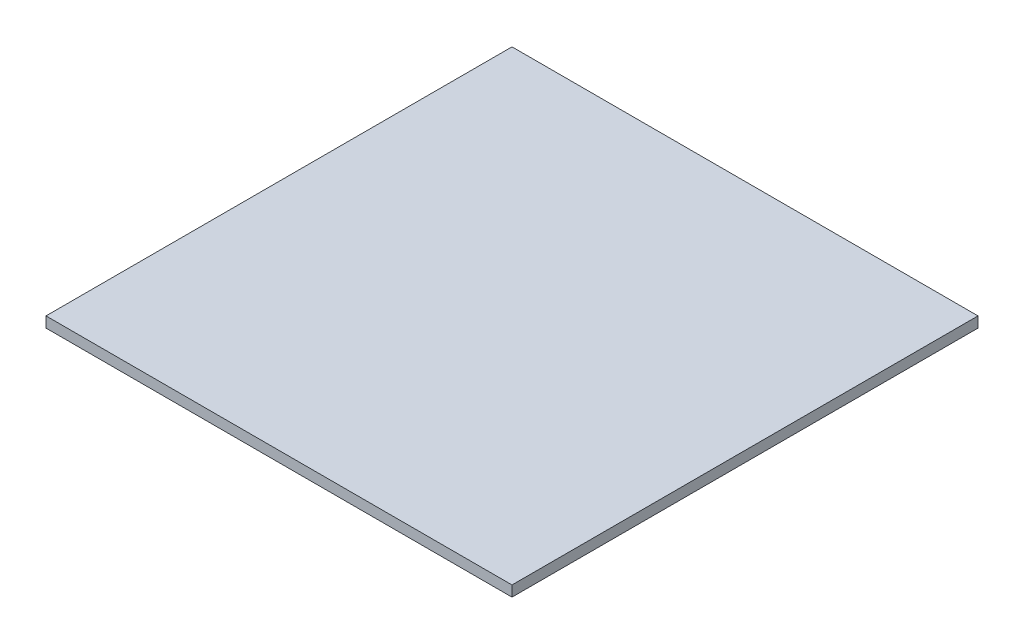
ISO-10303-21;
HEADER;
FILE_DESCRIPTION(('STEP AP214'),'2;1');
FILE_NAME('part.step','',(''),(''),'','','');
FILE_SCHEMA(('AUTOMOTIVE_DESIGN { 1 0 10303 214 1 1 1 1 }'));
ENDSEC;
DATA;
#1=APPLICATION_CONTEXT('core data for automotive mechanical design processes');
#2=APPLICATION_PROTOCOL_DEFINITION('international standard','automotive_design',2000,#1);
#3=PRODUCT_CONTEXT('',#1,'mechanical');
#4=PRODUCT('Part','Part','',(#3));
#5=PRODUCT_RELATED_PRODUCT_CATEGORY('part','',(#4));
#6=PRODUCT_DEFINITION_FORMATION('','',#4);
#7=PRODUCT_DEFINITION_CONTEXT('part definition',#1,'design');
#8=PRODUCT_DEFINITION('design','',#6,#7);
#9=PRODUCT_DEFINITION_SHAPE('','',#8);
#10=(LENGTH_UNIT() NAMED_UNIT(*) SI_UNIT(.MILLI.,.METRE.));
#11=(NAMED_UNIT(*) PLANE_ANGLE_UNIT() SI_UNIT($,.RADIAN.));
#12=(NAMED_UNIT(*) SI_UNIT($,.STERADIAN.) SOLID_ANGLE_UNIT());
#13=UNCERTAINTY_MEASURE_WITH_UNIT(LENGTH_MEASURE(1.E-05),#10,'distance_accuracy_value','');
#14=(GEOMETRIC_REPRESENTATION_CONTEXT(3) GLOBAL_UNCERTAINTY_ASSIGNED_CONTEXT((#13)) GLOBAL_UNIT_ASSIGNED_CONTEXT((#10,
#11,#12)) REPRESENTATION_CONTEXT('',''));
#15=CARTESIAN_POINT('',(0.,0.,0.));
#16=DIRECTION('',(0.,0.,1.));
#17=DIRECTION('',(1.,0.,0.));
#18=AXIS2_PLACEMENT_3D('',#15,#16,#17);
#19=CARTESIAN_POINT('',(109.999999999999,5.,110.));
#20=DIRECTION('',(-1.,0.,0.));
#21=DIRECTION('',(0.,0.,1.));
#22=AXIS2_PLACEMENT_3D('',#19,#20,#21);
#23=PLANE('',#22);
#24=DIRECTION('',(0.,0.,-1.));
#25=VECTOR('',#24,1.);
#26=CARTESIAN_POINT('',(109.999999999999,0.,110.));
#27=LINE('',#26,#25);
#28=CARTESIAN_POINT('',(109.999999999999,0.,110.));
#29=VERTEX_POINT('',#28);
#30=CARTESIAN_POINT('',(109.999999999999,0.,-110.));
#31=VERTEX_POINT('',#30);
#32=EDGE_CURVE('E107',#29,#31,#27,.T.);
#33=ORIENTED_EDGE('',*,*,#32,.T.);
#34=DIRECTION('',(0.,-1.,0.));
#35=VECTOR('',#34,1.);
#36=CARTESIAN_POINT('',(109.999999999999,5.,-110.));
#37=LINE('',#36,#35);
#38=CARTESIAN_POINT('',(109.999999999999,5.,-110.));
#39=VERTEX_POINT('',#38);
#40=EDGE_CURVE('E11',#39,#31,#37,.T.);
#41=ORIENTED_EDGE('',*,*,#40,.F.);
#42=DIRECTION('',(0.,0.,-1.));
#43=VECTOR('',#42,1.);
#44=CARTESIAN_POINT('',(109.999999999999,5.,110.));
#45=LINE('',#44,#43);
#46=CARTESIAN_POINT('',(109.999999999999,5.,110.));
#47=VERTEX_POINT('',#46);
#48=EDGE_CURVE('E91',#47,#39,#45,.T.);
#49=ORIENTED_EDGE('',*,*,#48,.F.);
#50=DIRECTION('',(0.,-1.,0.));
#51=VECTOR('',#50,1.);
#52=CARTESIAN_POINT('',(109.999999999999,5.,110.));
#53=LINE('',#52,#51);
#54=EDGE_CURVE('E103',#47,#29,#53,.T.);
#55=ORIENTED_EDGE('',*,*,#54,.T.);
#56=EDGE_LOOP('',(#33,#41,#49,#55));
#57=FACE_BOUND('',#56,.T.);
#58=ADVANCED_FACE('F39',(#57),#23,.F.);
#59=CARTESIAN_POINT('',(-110.,5.,-110.));
#60=DIRECTION('',(0.,0.,1.));
#61=DIRECTION('',(1.,0.,0.));
#62=AXIS2_PLACEMENT_3D('',#59,#60,#61);
#63=PLANE('',#62);
#64=DIRECTION('',(-1.,0.,0.));
#65=VECTOR('',#64,1.);
#66=CARTESIAN_POINT('',(-110.,0.,-110.));
#67=LINE('',#66,#65);
#68=CARTESIAN_POINT('',(-110.,0.,-110.));
#69=VERTEX_POINT('',#68);
#70=EDGE_CURVE('E96',#31,#69,#67,.T.);
#71=ORIENTED_EDGE('',*,*,#70,.T.);
#72=DIRECTION('',(0.,-1.,0.));
#73=VECTOR('',#72,1.);
#74=CARTESIAN_POINT('',(-110.,5.,-110.));
#75=LINE('',#74,#73);
#76=CARTESIAN_POINT('',(-110.,5.,-110.));
#77=VERTEX_POINT('',#76);
#78=EDGE_CURVE('E48',#77,#69,#75,.T.);
#79=ORIENTED_EDGE('',*,*,#78,.F.);
#80=DIRECTION('',(-1.,0.,0.));
#81=VECTOR('',#80,1.);
#82=CARTESIAN_POINT('',(-110.,5.,-110.));
#83=LINE('',#82,#81);
#84=EDGE_CURVE('E86',#39,#77,#83,.T.);
#85=ORIENTED_EDGE('',*,*,#84,.F.);
#86=ORIENTED_EDGE('',*,*,#40,.T.);
#87=EDGE_LOOP('',(#71,#79,#85,#86));
#88=FACE_BOUND('',#87,.T.);
#89=ADVANCED_FACE('F95',(#88),#63,.F.);
#90=CARTESIAN_POINT('',(-110.,5.,110.));
#91=DIRECTION('',(1.,0.,0.));
#92=DIRECTION('',(0.,0.,-1.));
#93=AXIS2_PLACEMENT_3D('',#90,#91,#92);
#94=PLANE('',#93);
#95=DIRECTION('',(0.,0.,1.));
#96=VECTOR('',#95,1.);
#97=CARTESIAN_POINT('',(-110.,0.,110.));
#98=LINE('',#97,#96);
#99=CARTESIAN_POINT('',(-110.,0.,110.));
#100=VERTEX_POINT('',#99);
#101=EDGE_CURVE('E73',#69,#100,#98,.T.);
#102=ORIENTED_EDGE('',*,*,#101,.T.);
#103=DIRECTION('',(0.,-1.,0.));
#104=VECTOR('',#103,1.);
#105=CARTESIAN_POINT('',(-110.,5.,110.));
#106=LINE('',#105,#104);
#107=CARTESIAN_POINT('',(-110.,5.,110.));
#108=VERTEX_POINT('',#107);
#109=EDGE_CURVE('E98',#108,#100,#106,.T.);
#110=ORIENTED_EDGE('',*,*,#109,.F.);
#111=DIRECTION('',(0.,0.,1.));
#112=VECTOR('',#111,1.);
#113=CARTESIAN_POINT('',(-110.,5.,110.));
#114=LINE('',#113,#112);
#115=EDGE_CURVE('E89',#77,#108,#114,.T.);
#116=ORIENTED_EDGE('',*,*,#115,.F.);
#117=ORIENTED_EDGE('',*,*,#78,.T.);
#118=EDGE_LOOP('',(#102,#110,#116,#117));
#119=FACE_BOUND('',#118,.T.);
#120=ADVANCED_FACE('F99',(#119),#94,.F.);
#121=CARTESIAN_POINT('',(-110.,5.,110.));
#122=DIRECTION('',(0.,0.,-1.));
#123=DIRECTION('',(-1.,0.,0.));
#124=AXIS2_PLACEMENT_3D('',#121,#122,#123);
#125=PLANE('',#124);
#126=DIRECTION('',(1.,0.,0.));
#127=VECTOR('',#126,1.);
#128=CARTESIAN_POINT('',(-110.,0.,110.));
#129=LINE('',#128,#127);
#130=EDGE_CURVE('E79',#100,#29,#129,.T.);
#131=ORIENTED_EDGE('',*,*,#130,.T.);
#132=ORIENTED_EDGE('',*,*,#54,.F.);
#133=DIRECTION('',(1.,0.,0.));
#134=VECTOR('',#133,1.);
#135=CARTESIAN_POINT('',(-110.,5.,110.));
#136=LINE('',#135,#134);
#137=EDGE_CURVE('E56',#108,#47,#136,.T.);
#138=ORIENTED_EDGE('',*,*,#137,.F.);
#139=ORIENTED_EDGE('',*,*,#109,.T.);
#140=EDGE_LOOP('',(#131,#132,#138,#139));
#141=FACE_BOUND('',#140,.T.);
#142=ADVANCED_FACE('F120',(#141),#125,.F.);
#143=CARTESIAN_POINT('',(0.,5.,0.));
#144=DIRECTION('',(0.,-1.,0.));
#145=DIRECTION('',(0.,0.,-1.));
#146=AXIS2_PLACEMENT_3D('',#143,#144,#145);
#147=PLANE('',#146);
#148=ORIENTED_EDGE('',*,*,#48,.T.);
#149=ORIENTED_EDGE('',*,*,#84,.T.);
#150=ORIENTED_EDGE('',*,*,#115,.T.);
#151=ORIENTED_EDGE('',*,*,#137,.T.);
#152=EDGE_LOOP('',(#148,#149,#150,#151));
#153=FACE_BOUND('',#152,.T.);
#154=ADVANCED_FACE('F87',(#153),#147,.F.);
#155=CARTESIAN_POINT('',(0.,0.,0.));
#156=DIRECTION('',(0.,-1.,0.));
#157=DIRECTION('',(0.,0.,-1.));
#158=AXIS2_PLACEMENT_3D('',#155,#156,#157);
#159=PLANE('',#158);
#160=ORIENTED_EDGE('',*,*,#32,.F.);
#161=ORIENTED_EDGE('',*,*,#130,.F.);
#162=ORIENTED_EDGE('',*,*,#101,.F.);
#163=ORIENTED_EDGE('',*,*,#70,.F.);
#164=EDGE_LOOP('',(#160,#161,#162,#163));
#165=FACE_BOUND('',#164,.T.);
#166=ADVANCED_FACE('F123',(#165),#159,.T.);
#167=CLOSED_SHELL('',(#58,#89,#120,#142,#154,#166));
#168=MANIFOLD_SOLID_BREP('B2',#167);
#169=ADVANCED_BREP_SHAPE_REPRESENTATION('',(#18,#168),#14);
#170=SHAPE_DEFINITION_REPRESENTATION(#9,#169);
ENDSEC;
END-ISO-10303-21;
